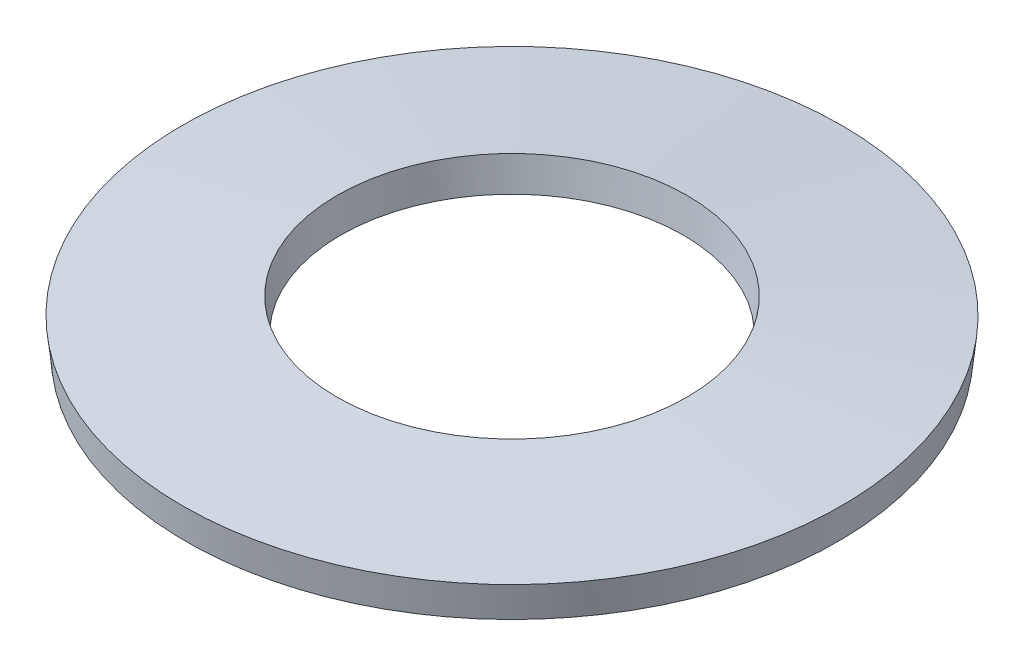
ISO-10303-21;
HEADER;
FILE_DESCRIPTION(('STEP AP214'),'2;1');
FILE_NAME('part.step','',(''),(''),'','','');
FILE_SCHEMA(('AUTOMOTIVE_DESIGN { 1 0 10303 214 1 1 1 1 }'));
ENDSEC;
DATA;
#1=APPLICATION_CONTEXT('core data for automotive mechanical design processes');
#2=APPLICATION_PROTOCOL_DEFINITION('international standard','automotive_design',2000,#1);
#3=PRODUCT_CONTEXT('',#1,'mechanical');
#4=PRODUCT('Part','Part','',(#3));
#5=PRODUCT_RELATED_PRODUCT_CATEGORY('part','',(#4));
#6=PRODUCT_DEFINITION_FORMATION('','',#4);
#7=PRODUCT_DEFINITION_CONTEXT('part definition',#1,'design');
#8=PRODUCT_DEFINITION('design','',#6,#7);
#9=PRODUCT_DEFINITION_SHAPE('','',#8);
#10=(LENGTH_UNIT() NAMED_UNIT(*) SI_UNIT(.MILLI.,.METRE.));
#11=(NAMED_UNIT(*) PLANE_ANGLE_UNIT() SI_UNIT($,.RADIAN.));
#12=(NAMED_UNIT(*) SI_UNIT($,.STERADIAN.) SOLID_ANGLE_UNIT());
#13=UNCERTAINTY_MEASURE_WITH_UNIT(LENGTH_MEASURE(1.E-05),#10,'distance_accuracy_value','');
#14=(GEOMETRIC_REPRESENTATION_CONTEXT(3) GLOBAL_UNCERTAINTY_ASSIGNED_CONTEXT((#13)) GLOBAL_UNIT_ASSIGNED_CONTEXT((#10,
#11,#12)) REPRESENTATION_CONTEXT('',''));
#15=CARTESIAN_POINT('',(0.,0.,0.));
#16=DIRECTION('',(0.,0.,1.));
#17=DIRECTION('',(1.,0.,0.));
#18=AXIS2_PLACEMENT_3D('',#15,#16,#17);
#19=CARTESIAN_POINT('',(0.,0.,0.));
#20=DIRECTION('',(0.,1.,0.));
#21=DIRECTION('',(0.,0.,1.));
#22=AXIS2_PLACEMENT_3D('',#19,#20,#21);
#23=CONICAL_SURFACE('',#22,4.94642427811524,0.107357552446469);
#24=CARTESIAN_POINT('',(0.,0.497121355429965,0.));
#25=DIRECTION('',(0.,-1.,0.));
#26=DIRECTION('',(0.,0.,-1.));
#27=AXIS2_PLACEMENT_3D('',#24,#25,#26);
#28=CIRCLE('',#27,5.);
#29=CARTESIAN_POINT('',(0.,0.497121355429965,-5.));
#30=VERTEX_POINT('',#29);
#31=EDGE_CURVE('E10',#30,#30,#28,.T.);
#32=ORIENTED_EDGE('',*,*,#31,.T.);
#33=EDGE_LOOP('',(#32));
#34=FACE_BOUND('',#33,.T.);
#35=CARTESIAN_POINT('',(0.,0.,0.));
#36=DIRECTION('',(0.,-1.,0.));
#37=DIRECTION('',(0.,0.,-1.));
#38=AXIS2_PLACEMENT_3D('',#35,#36,#37);
#39=CIRCLE('',#38,4.94642427811524);
#40=CARTESIAN_POINT('',(0.,0.,-4.94642427811524));
#41=VERTEX_POINT('',#40);
#42=EDGE_CURVE('E46',#41,#41,#39,.T.);
#43=ORIENTED_EDGE('',*,*,#42,.F.);
#44=EDGE_LOOP('',(#43));
#45=FACE_BOUND('',#44,.T.);
#46=ADVANCED_FACE('F32',(#34,#45),#23,.T.);
#47=CARTESIAN_POINT('',(0.,0.497121355429965,0.));
#48=DIRECTION('',(0.,-1.,0.));
#49=DIRECTION('',(0.,0.,-1.));
#50=AXIS2_PLACEMENT_3D('',#47,#48,#49);
#51=CONICAL_SURFACE('',#50,5.,1.46343877434843);
#52=CARTESIAN_POINT('',(0.,0.749999999999998,0.));
#53=DIRECTION('',(0.,-1.,0.));
#54=DIRECTION('',(0.,0.,-1.));
#55=AXIS2_PLACEMENT_3D('',#52,#53,#54);
#56=CIRCLE('',#55,2.65357572188476);
#57=CARTESIAN_POINT('',(0.,0.749999999999998,-2.65357572188476));
#58=VERTEX_POINT('',#57);
#59=EDGE_CURVE('E38',#58,#58,#56,.T.);
#60=ORIENTED_EDGE('',*,*,#59,.T.);
#61=EDGE_LOOP('',(#60));
#62=FACE_BOUND('',#61,.T.);
#63=ORIENTED_EDGE('',*,*,#31,.F.);
#64=EDGE_LOOP('',(#63));
#65=FACE_BOUND('',#64,.T.);
#66=ADVANCED_FACE('F56',(#62,#65),#51,.T.);
#67=CARTESIAN_POINT('',(0.,0.749999999999998,0.));
#68=DIRECTION('',(0.,1.,0.));
#69=DIRECTION('',(0.,0.,1.));
#70=AXIS2_PLACEMENT_3D('',#67,#68,#69);
#71=CONICAL_SURFACE('',#70,2.65357572188476,0.107357552446476);
#72=CARTESIAN_POINT('',(0.,0.252878644570032,0.));
#73=DIRECTION('',(0.,-1.,0.));
#74=DIRECTION('',(0.,0.,-1.));
#75=AXIS2_PLACEMENT_3D('',#72,#73,#74);
#76=CIRCLE('',#75,2.59999999999999);
#77=CARTESIAN_POINT('',(0.,0.252878644570032,-2.59999999999999));
#78=VERTEX_POINT('',#77);
#79=EDGE_CURVE('E42',#78,#78,#76,.T.);
#80=ORIENTED_EDGE('',*,*,#79,.T.);
#81=EDGE_LOOP('',(#80));
#82=FACE_BOUND('',#81,.T.);
#83=ORIENTED_EDGE('',*,*,#59,.F.);
#84=EDGE_LOOP('',(#83));
#85=FACE_BOUND('',#84,.T.);
#86=ADVANCED_FACE('F60',(#82,#85),#71,.F.);
#87=CARTESIAN_POINT('',(0.,0.252878644570032,0.));
#88=DIRECTION('',(0.,-1.,0.));
#89=DIRECTION('',(0.,0.,-1.));
#90=AXIS2_PLACEMENT_3D('',#87,#88,#89);
#91=CONICAL_SURFACE('',#90,2.59999999999999,1.46343877434843);
#92=ORIENTED_EDGE('',*,*,#42,.T.);
#93=EDGE_LOOP('',(#92));
#94=FACE_BOUND('',#93,.T.);
#95=ORIENTED_EDGE('',*,*,#79,.F.);
#96=EDGE_LOOP('',(#95));
#97=FACE_BOUND('',#96,.T.);
#98=ADVANCED_FACE('F52',(#94,#97),#91,.F.);
#99=CLOSED_SHELL('',(#46,#66,#86,#98));
#100=MANIFOLD_SOLID_BREP('B2',#99);
#101=ADVANCED_BREP_SHAPE_REPRESENTATION('',(#18,#100),#14);
#102=SHAPE_DEFINITION_REPRESENTATION(#9,#101);
ENDSEC;
END-ISO-10303-21;
